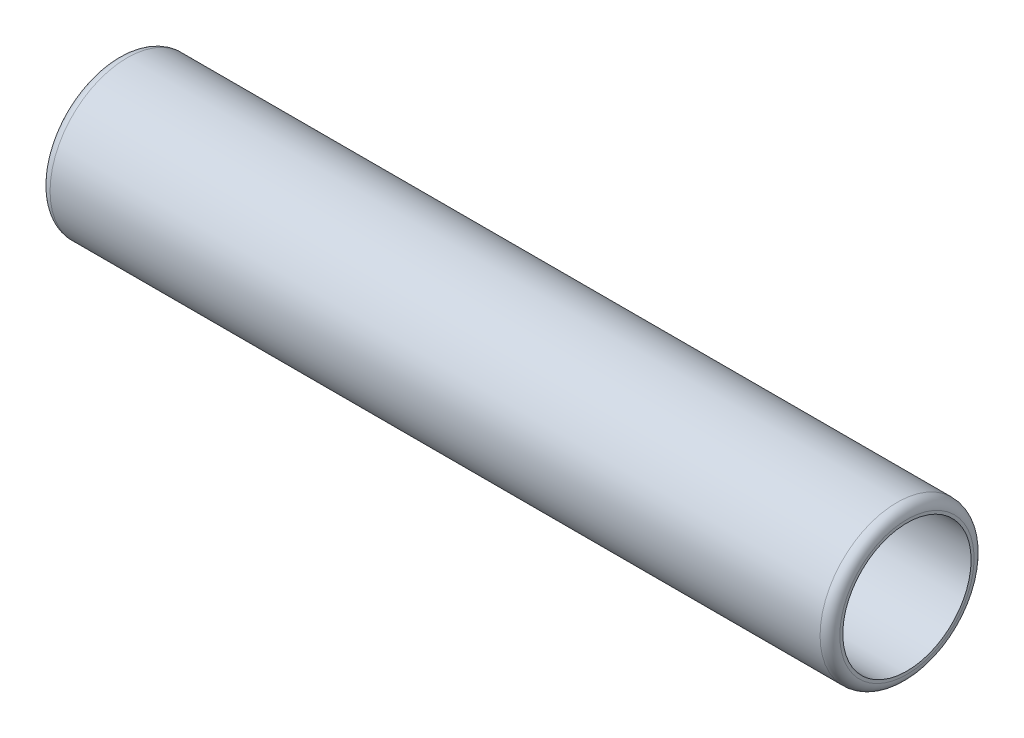
ISO-10303-21;
HEADER;
FILE_DESCRIPTION(('STEP AP214'),'2;1');
FILE_NAME('part.step','',(''),(''),'','','');
FILE_SCHEMA(('AUTOMOTIVE_DESIGN { 1 0 10303 214 1 1 1 1 }'));
ENDSEC;
DATA;
#1=APPLICATION_CONTEXT('core data for automotive mechanical design processes');
#2=APPLICATION_PROTOCOL_DEFINITION('international standard','automotive_design',2000,#1);
#3=PRODUCT_CONTEXT('',#1,'mechanical');
#4=PRODUCT('Part','Part','',(#3));
#5=PRODUCT_RELATED_PRODUCT_CATEGORY('part','',(#4));
#6=PRODUCT_DEFINITION_FORMATION('','',#4);
#7=PRODUCT_DEFINITION_CONTEXT('part definition',#1,'design');
#8=PRODUCT_DEFINITION('design','',#6,#7);
#9=PRODUCT_DEFINITION_SHAPE('','',#8);
#10=(LENGTH_UNIT() NAMED_UNIT(*) SI_UNIT(.MILLI.,.METRE.));
#11=(NAMED_UNIT(*) PLANE_ANGLE_UNIT() SI_UNIT($,.RADIAN.));
#12=(NAMED_UNIT(*) SI_UNIT($,.STERADIAN.) SOLID_ANGLE_UNIT());
#13=UNCERTAINTY_MEASURE_WITH_UNIT(LENGTH_MEASURE(1.E-05),#10,'distance_accuracy_value','');
#14=(GEOMETRIC_REPRESENTATION_CONTEXT(3) GLOBAL_UNCERTAINTY_ASSIGNED_CONTEXT((#13)) GLOBAL_UNIT_ASSIGNED_CONTEXT((#10,
#11,#12)) REPRESENTATION_CONTEXT('',''));
#15=CARTESIAN_POINT('',(0.,0.,0.));
#16=DIRECTION('',(0.,0.,1.));
#17=DIRECTION('',(1.,0.,0.));
#18=AXIS2_PLACEMENT_3D('',#15,#16,#17);
#19=CARTESIAN_POINT('',(40.,7.8,0.));
#20=DIRECTION('',(-1.,0.,0.));
#21=DIRECTION('',(0.,0.,1.));
#22=AXIS2_PLACEMENT_3D('',#19,#20,#21);
#23=PLANE('',#22);
#24=CARTESIAN_POINT('',(40.,0.,0.));
#25=DIRECTION('',(-1.,0.,0.));
#26=DIRECTION('',(0.,0.,1.));
#27=AXIS2_PLACEMENT_3D('',#24,#25,#26);
#28=CIRCLE('',#27,6.8);
#29=CARTESIAN_POINT('',(40.,0.,6.8));
#30=VERTEX_POINT('',#29);
#31=EDGE_CURVE('E41',#30,#30,#28,.F.);
#32=ORIENTED_EDGE('',*,*,#31,.T.);
#33=EDGE_LOOP('',(#32));
#34=FACE_BOUND('',#33,.T.);
#35=CARTESIAN_POINT('',(40.,0.,0.));
#36=DIRECTION('',(1.,0.,0.));
#37=DIRECTION('',(0.,0.,-1.));
#38=AXIS2_PLACEMENT_3D('',#35,#36,#37);
#39=CIRCLE('',#38,6.5);
#40=CARTESIAN_POINT('',(40.,0.,-6.5));
#41=VERTEX_POINT('',#40);
#42=EDGE_CURVE('E58',#41,#41,#39,.T.);
#43=ORIENTED_EDGE('',*,*,#42,.F.);
#44=EDGE_LOOP('',(#43));
#45=FACE_BOUND('',#44,.T.);
#46=ADVANCED_FACE('F34',(#34,#45),#23,.F.);
#47=CARTESIAN_POINT('',(-40.,0.,0.));
#48=DIRECTION('',(-1.,0.,0.));
#49=DIRECTION('',(0.,0.,1.));
#50=AXIS2_PLACEMENT_3D('',#47,#48,#49);
#51=CYLINDRICAL_SURFACE('',#50,7.8);
#52=CARTESIAN_POINT('',(39.,0.,0.));
#53=DIRECTION('',(-1.,0.,0.));
#54=DIRECTION('',(0.,0.,1.));
#55=AXIS2_PLACEMENT_3D('',#52,#53,#54);
#56=CIRCLE('',#55,7.8);
#57=CARTESIAN_POINT('',(39.,0.,7.8));
#58=VERTEX_POINT('',#57);
#59=EDGE_CURVE('E45',#58,#58,#56,.T.);
#60=ORIENTED_EDGE('',*,*,#59,.T.);
#61=EDGE_LOOP('',(#60));
#62=FACE_BOUND('',#61,.T.);
#63=CARTESIAN_POINT('',(-39.,0.,0.));
#64=DIRECTION('',(1.,0.,0.));
#65=DIRECTION('',(0.,0.,-1.));
#66=AXIS2_PLACEMENT_3D('',#63,#64,#65);
#67=CIRCLE('',#66,7.8);
#68=CARTESIAN_POINT('',(-39.,0.,-7.8));
#69=VERTEX_POINT('',#68);
#70=EDGE_CURVE('E49',#69,#69,#67,.T.);
#71=ORIENTED_EDGE('',*,*,#70,.T.);
#72=EDGE_LOOP('',(#71));
#73=FACE_BOUND('',#72,.T.);
#74=ADVANCED_FACE('F84',(#62,#73),#51,.T.);
#75=CARTESIAN_POINT('',(-40.,0.,0.));
#76=DIRECTION('',(1.,0.,0.));
#77=DIRECTION('',(0.,0.,-1.));
#78=AXIS2_PLACEMENT_3D('',#75,#76,#77);
#79=PLANE('',#78);
#80=CARTESIAN_POINT('',(-40.,0.,0.));
#81=DIRECTION('',(1.,0.,0.));
#82=DIRECTION('',(0.,0.,-1.));
#83=AXIS2_PLACEMENT_3D('',#80,#81,#82);
#84=CIRCLE('',#83,6.8);
#85=CARTESIAN_POINT('',(-40.,0.,-6.8));
#86=VERTEX_POINT('',#85);
#87=EDGE_CURVE('E10',#86,#86,#84,.F.);
#88=ORIENTED_EDGE('',*,*,#87,.T.);
#89=EDGE_LOOP('',(#88));
#90=FACE_BOUND('',#89,.T.);
#91=CARTESIAN_POINT('',(-40.,0.,0.));
#92=DIRECTION('',(1.,0.,0.));
#93=DIRECTION('',(0.,0.,-1.));
#94=AXIS2_PLACEMENT_3D('',#91,#92,#93);
#95=CIRCLE('',#94,4.25);
#96=CARTESIAN_POINT('',(-40.,0.,-4.25));
#97=VERTEX_POINT('',#96);
#98=EDGE_CURVE('E59',#97,#97,#95,.T.);
#99=ORIENTED_EDGE('',*,*,#98,.T.);
#100=EDGE_LOOP('',(#99));
#101=FACE_BOUND('',#100,.T.);
#102=ADVANCED_FACE('F67',(#90,#101),#79,.F.);
#103=CARTESIAN_POINT('',(15.,0.,0.));
#104=DIRECTION('',(1.,0.,0.));
#105=DIRECTION('',(0.,0.,-1.));
#106=AXIS2_PLACEMENT_3D('',#103,#104,#105);
#107=CYLINDRICAL_SURFACE('',#106,6.5);
#108=CARTESIAN_POINT('',(15.,0.,0.));
#109=DIRECTION('',(1.,0.,0.));
#110=DIRECTION('',(0.,0.,-1.));
#111=AXIS2_PLACEMENT_3D('',#108,#109,#110);
#112=CIRCLE('',#111,6.5);
#113=CARTESIAN_POINT('',(15.,0.,-6.5));
#114=VERTEX_POINT('',#113);
#115=EDGE_CURVE('E54',#114,#114,#112,.T.);
#116=ORIENTED_EDGE('',*,*,#115,.F.);
#117=EDGE_LOOP('',(#116));
#118=FACE_BOUND('',#117,.T.);
#119=ORIENTED_EDGE('',*,*,#42,.T.);
#120=EDGE_LOOP('',(#119));
#121=FACE_BOUND('',#120,.T.);
#122=ADVANCED_FACE('F80',(#118,#121),#107,.F.);
#123=CARTESIAN_POINT('',(15.,0.,0.));
#124=DIRECTION('',(1.,0.,0.));
#125=DIRECTION('',(0.,0.,-1.));
#126=AXIS2_PLACEMENT_3D('',#123,#124,#125);
#127=PLANE('',#126);
#128=CARTESIAN_POINT('',(15.,0.,0.));
#129=DIRECTION('',(1.,0.,0.));
#130=DIRECTION('',(0.,0.,-1.));
#131=AXIS2_PLACEMENT_3D('',#128,#129,#130);
#132=CIRCLE('',#131,4.25);
#133=CARTESIAN_POINT('',(15.,0.,-4.25));
#134=VERTEX_POINT('',#133);
#135=EDGE_CURVE('E55',#134,#134,#132,.T.);
#136=ORIENTED_EDGE('',*,*,#135,.F.);
#137=EDGE_LOOP('',(#136));
#138=FACE_BOUND('',#137,.T.);
#139=ORIENTED_EDGE('',*,*,#115,.T.);
#140=EDGE_LOOP('',(#139));
#141=FACE_BOUND('',#140,.T.);
#142=ADVANCED_FACE('F72',(#138,#141),#127,.T.);
#143=CARTESIAN_POINT('',(-40.,0.,0.));
#144=DIRECTION('',(1.,0.,0.));
#145=DIRECTION('',(0.,0.,-1.));
#146=AXIS2_PLACEMENT_3D('',#143,#144,#145);
#147=CYLINDRICAL_SURFACE('',#146,4.25);
#148=ORIENTED_EDGE('',*,*,#135,.T.);
#149=EDGE_LOOP('',(#148));
#150=FACE_BOUND('',#149,.T.);
#151=ORIENTED_EDGE('',*,*,#98,.F.);
#152=EDGE_LOOP('',(#151));
#153=FACE_BOUND('',#152,.T.);
#154=ADVANCED_FACE('F69',(#150,#153),#147,.F.);
#155=CARTESIAN_POINT('',(39.,0.,0.));
#156=DIRECTION('',(-1.,0.,0.));
#157=DIRECTION('',(0.,0.,1.));
#158=AXIS2_PLACEMENT_3D('',#155,#156,#157);
#159=TOROIDAL_SURFACE('',#158,6.8,1.);
#160=ORIENTED_EDGE('',*,*,#31,.F.);
#161=EDGE_LOOP('',(#160));
#162=FACE_BOUND('',#161,.T.);
#163=ORIENTED_EDGE('',*,*,#59,.F.);
#164=EDGE_LOOP('',(#163));
#165=FACE_BOUND('',#164,.T.);
#166=ADVANCED_FACE('F71',(#162,#165),#159,.T.);
#167=CARTESIAN_POINT('',(-39.,0.,0.));
#168=DIRECTION('',(1.,0.,0.));
#169=DIRECTION('',(0.,0.,-1.));
#170=AXIS2_PLACEMENT_3D('',#167,#168,#169);
#171=TOROIDAL_SURFACE('',#170,6.8,1.);
#172=ORIENTED_EDGE('',*,*,#70,.F.);
#173=EDGE_LOOP('',(#172));
#174=FACE_BOUND('',#173,.T.);
#175=ORIENTED_EDGE('',*,*,#87,.F.);
#176=EDGE_LOOP('',(#175));
#177=FACE_BOUND('',#176,.T.);
#178=ADVANCED_FACE('F36',(#174,#177),#171,.T.);
#179=CLOSED_SHELL('',(#46,#74,#102,#122,#142,#154,#166,#178));
#180=MANIFOLD_SOLID_BREP('B2',#179);
#181=ADVANCED_BREP_SHAPE_REPRESENTATION('',(#18,#180),#14);
#182=SHAPE_DEFINITION_REPRESENTATION(#9,#181);
ENDSEC;
END-ISO-10303-21;
